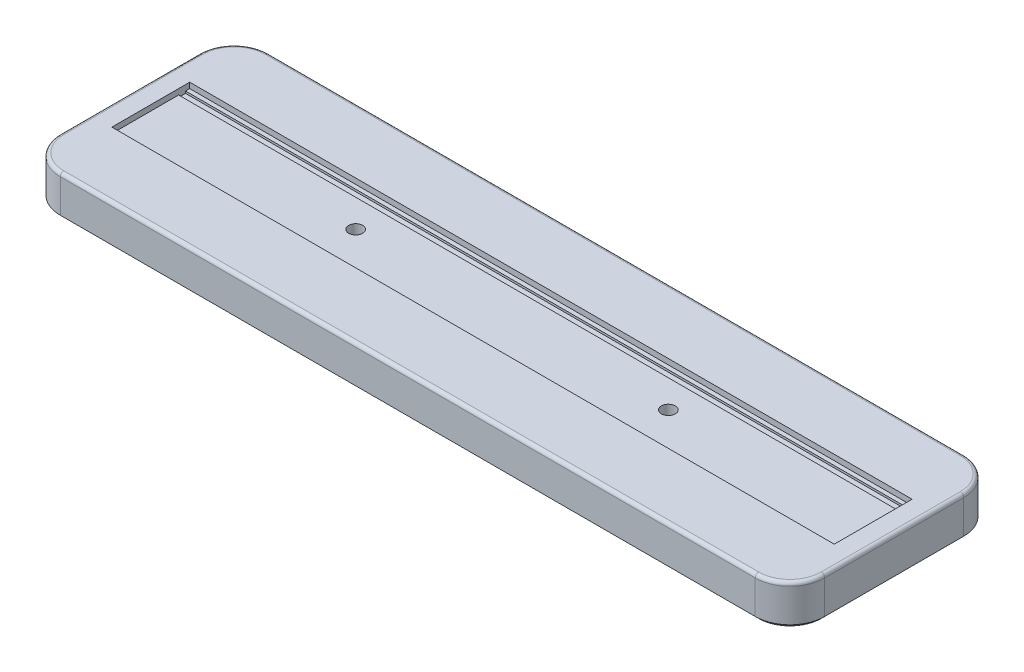
ISO-10303-21;
HEADER;
FILE_DESCRIPTION(('STEP AP214'),'2;1');
FILE_NAME('part.step','',(''),(''),'','','');
FILE_SCHEMA(('AUTOMOTIVE_DESIGN { 1 0 10303 214 1 1 1 1 }'));
ENDSEC;
DATA;
#1=APPLICATION_CONTEXT('core data for automotive mechanical design processes');
#2=APPLICATION_PROTOCOL_DEFINITION('international standard','automotive_design',2000,#1);
#3=PRODUCT_CONTEXT('',#1,'mechanical');
#4=PRODUCT('Part','Part','',(#3));
#5=PRODUCT_RELATED_PRODUCT_CATEGORY('part','',(#4));
#6=PRODUCT_DEFINITION_FORMATION('','',#4);
#7=PRODUCT_DEFINITION_CONTEXT('part definition',#1,'design');
#8=PRODUCT_DEFINITION('design','',#6,#7);
#9=PRODUCT_DEFINITION_SHAPE('','',#8);
#10=(LENGTH_UNIT() NAMED_UNIT(*) SI_UNIT(.MILLI.,.METRE.));
#11=(NAMED_UNIT(*) PLANE_ANGLE_UNIT() SI_UNIT($,.RADIAN.));
#12=(NAMED_UNIT(*) SI_UNIT($,.STERADIAN.) SOLID_ANGLE_UNIT());
#13=UNCERTAINTY_MEASURE_WITH_UNIT(LENGTH_MEASURE(1.E-05),#10,'distance_accuracy_value','');
#14=(GEOMETRIC_REPRESENTATION_CONTEXT(3) GLOBAL_UNCERTAINTY_ASSIGNED_CONTEXT((#13)) GLOBAL_UNIT_ASSIGNED_CONTEXT((#10,
#11,#12)) REPRESENTATION_CONTEXT('',''));
#15=CARTESIAN_POINT('',(0.,0.,0.));
#16=DIRECTION('',(0.,0.,1.));
#17=DIRECTION('',(1.,0.,0.));
#18=AXIS2_PLACEMENT_3D('',#15,#16,#17);
#19=CARTESIAN_POINT('',(0.,10.,0.));
#20=DIRECTION('',(0.,-1.,0.));
#21=DIRECTION('',(0.,0.,-1.));
#22=AXIS2_PLACEMENT_3D('',#19,#20,#21);
#23=PLANE('',#22);
#24=DIRECTION('',(0.,0.,1.));
#25=VECTOR('',#24,1.);
#26=CARTESIAN_POINT('',(-103.95,10.,11.2));
#27=LINE('',#26,#25);
#28=CARTESIAN_POINT('',(-103.95,10.,-11.2));
#29=VERTEX_POINT('',#28);
#30=CARTESIAN_POINT('',(-103.95,10.,-10.));
#31=VERTEX_POINT('',#30);
#32=EDGE_CURVE('E281',#29,#31,#27,.T.);
#33=ORIENTED_EDGE('',*,*,#32,.T.);
#34=DIRECTION('',(-1.,0.,0.));
#35=VECTOR('',#34,1.);
#36=CARTESIAN_POINT('',(-103.95,10.,-10.));
#37=LINE('',#36,#35);
#38=CARTESIAN_POINT('',(103.95,10.,-10.));
#39=VERTEX_POINT('',#38);
#40=EDGE_CURVE('E59',#39,#31,#37,.T.);
#41=ORIENTED_EDGE('',*,*,#40,.F.);
#42=DIRECTION('',(0.,0.,-1.));
#43=VECTOR('',#42,1.);
#44=CARTESIAN_POINT('',(103.95,10.,11.2));
#45=LINE('',#44,#43);
#46=CARTESIAN_POINT('',(103.95,10.,-11.2));
#47=VERTEX_POINT('',#46);
#48=EDGE_CURVE('E274',#39,#47,#45,.T.);
#49=ORIENTED_EDGE('',*,*,#48,.T.);
#50=DIRECTION('',(-1.,0.,0.));
#51=VECTOR('',#50,1.);
#52=CARTESIAN_POINT('',(-103.95,10.,-11.2));
#53=LINE('',#52,#51);
#54=EDGE_CURVE('E278',#47,#29,#53,.T.);
#55=ORIENTED_EDGE('',*,*,#54,.T.);
#56=EDGE_LOOP('',(#33,#41,#49,#55));
#57=FACE_BOUND('',#56,.T.);
#58=ADVANCED_FACE('F41',(#57),#23,.F.);
#59=CARTESIAN_POINT('',(103.95,10.,11.2));
#60=VERTEX_POINT('',#59);
#61=CARTESIAN_POINT('',(103.95,10.,-8.));
#62=VERTEX_POINT('',#61);
#63=EDGE_CURVE('E275',#60,#62,#45,.T.);
#64=ORIENTED_EDGE('',*,*,#63,.T.);
#65=DIRECTION('',(1.,0.,0.));
#66=VECTOR('',#65,1.);
#67=CARTESIAN_POINT('',(-103.95,10.,-8.));
#68=LINE('',#67,#66);
#69=CARTESIAN_POINT('',(-103.95,10.,-8.));
#70=VERTEX_POINT('',#69);
#71=EDGE_CURVE('E232',#70,#62,#68,.T.);
#72=ORIENTED_EDGE('',*,*,#71,.F.);
#73=CARTESIAN_POINT('',(-103.95,10.,11.2));
#74=VERTEX_POINT('',#73);
#75=EDGE_CURVE('E214',#70,#74,#27,.T.);
#76=ORIENTED_EDGE('',*,*,#75,.T.);
#77=DIRECTION('',(1.,0.,0.));
#78=VECTOR('',#77,1.);
#79=CARTESIAN_POINT('',(-103.95,10.,11.2));
#80=LINE('',#79,#78);
#81=EDGE_CURVE('E284',#74,#60,#80,.T.);
#82=ORIENTED_EDGE('',*,*,#81,.T.);
#83=EDGE_LOOP('',(#64,#72,#76,#82));
#84=FACE_BOUND('',#83,.T.);
#85=CARTESIAN_POINT('',(-45.,10.,0.));
#86=DIRECTION('',(0.,1.,0.));
#87=DIRECTION('',(0.,0.,1.));
#88=AXIS2_PLACEMENT_3D('',#85,#86,#87);
#89=CIRCLE('',#88,2.);
#90=CARTESIAN_POINT('',(-45.,10.,2.));
#91=VERTEX_POINT('',#90);
#92=EDGE_CURVE('E271',#91,#91,#89,.T.);
#93=ORIENTED_EDGE('',*,*,#92,.F.);
#94=EDGE_LOOP('',(#93));
#95=FACE_BOUND('',#94,.T.);
#96=CARTESIAN_POINT('',(45.,10.,0.));
#97=DIRECTION('',(0.,1.,0.));
#98=DIRECTION('',(0.,0.,1.));
#99=AXIS2_PLACEMENT_3D('',#96,#97,#98);
#100=CIRCLE('',#99,2.);
#101=CARTESIAN_POINT('',(45.,10.,1.99999999999999));
#102=VERTEX_POINT('',#101);
#103=EDGE_CURVE('E247',#102,#102,#100,.T.);
#104=ORIENTED_EDGE('',*,*,#103,.F.);
#105=EDGE_LOOP('',(#104));
#106=FACE_BOUND('',#105,.T.);
#107=ADVANCED_FACE('F522',(#84,#95,#106),#23,.F.);
#108=CARTESIAN_POINT('',(0.,0.,0.));
#109=DIRECTION('',(0.,-1.,0.));
#110=DIRECTION('',(0.,0.,-1.));
#111=AXIS2_PLACEMENT_3D('',#108,#109,#110);
#112=PLANE('',#111);
#113=DIRECTION('',(0.,0.,1.));
#114=VECTOR('',#113,1.);
#115=CARTESIAN_POINT('',(109.,0.,0.));
#116=LINE('',#115,#114);
#117=CARTESIAN_POINT('',(109.,0.,-20.));
#118=VERTEX_POINT('',#117);
#119=CARTESIAN_POINT('',(109.,0.,20.));
#120=VERTEX_POINT('',#119);
#121=EDGE_CURVE('E383',#118,#120,#116,.T.);
#122=ORIENTED_EDGE('',*,*,#121,.T.);
#123=CARTESIAN_POINT('',(100.,0.,20.));
#124=DIRECTION('',(0.,-1.,0.));
#125=DIRECTION('',(0.,0.,-1.));
#126=AXIS2_PLACEMENT_3D('',#123,#124,#125);
#127=CIRCLE('',#126,8.99999999999999);
#128=CARTESIAN_POINT('',(100.,0.,29.));
#129=VERTEX_POINT('',#128);
#130=EDGE_CURVE('E385',#120,#129,#127,.T.);
#131=ORIENTED_EDGE('',*,*,#130,.T.);
#132=DIRECTION('',(-1.,0.,0.));
#133=VECTOR('',#132,1.);
#134=CARTESIAN_POINT('',(0.,0.,29.));
#135=LINE('',#134,#133);
#136=CARTESIAN_POINT('',(-100.,0.,29.));
#137=VERTEX_POINT('',#136);
#138=EDGE_CURVE('E371',#129,#137,#135,.T.);
#139=ORIENTED_EDGE('',*,*,#138,.T.);
#140=CARTESIAN_POINT('',(-100.,0.,20.));
#141=DIRECTION('',(0.,-1.,0.));
#142=DIRECTION('',(0.,0.,-1.));
#143=AXIS2_PLACEMENT_3D('',#140,#141,#142);
#144=CIRCLE('',#143,8.99999999999999);
#145=CARTESIAN_POINT('',(-109.,0.,20.));
#146=VERTEX_POINT('',#145);
#147=EDGE_CURVE('E373',#137,#146,#144,.T.);
#148=ORIENTED_EDGE('',*,*,#147,.T.);
#149=DIRECTION('',(0.,0.,-1.));
#150=VECTOR('',#149,1.);
#151=CARTESIAN_POINT('',(-109.,0.,0.));
#152=LINE('',#151,#150);
#153=CARTESIAN_POINT('',(-109.,0.,-20.));
#154=VERTEX_POINT('',#153);
#155=EDGE_CURVE('E375',#146,#154,#152,.T.);
#156=ORIENTED_EDGE('',*,*,#155,.T.);
#157=CARTESIAN_POINT('',(-100.,0.,-20.));
#158=DIRECTION('',(0.,-1.,0.));
#159=DIRECTION('',(0.,0.,-1.));
#160=AXIS2_PLACEMENT_3D('',#157,#158,#159);
#161=CIRCLE('',#160,8.99999999999999);
#162=CARTESIAN_POINT('',(-100.,0.,-29.));
#163=VERTEX_POINT('',#162);
#164=EDGE_CURVE('E377',#154,#163,#161,.T.);
#165=ORIENTED_EDGE('',*,*,#164,.T.);
#166=DIRECTION('',(1.,0.,0.));
#167=VECTOR('',#166,1.);
#168=CARTESIAN_POINT('',(0.,0.,-29.));
#169=LINE('',#168,#167);
#170=CARTESIAN_POINT('',(100.,0.,-29.));
#171=VERTEX_POINT('',#170);
#172=EDGE_CURVE('E379',#163,#171,#169,.T.);
#173=ORIENTED_EDGE('',*,*,#172,.T.);
#174=CARTESIAN_POINT('',(100.,0.,-20.));
#175=DIRECTION('',(0.,-1.,0.));
#176=DIRECTION('',(0.,0.,-1.));
#177=AXIS2_PLACEMENT_3D('',#174,#175,#176);
#178=CIRCLE('',#177,8.99999999999999);
#179=EDGE_CURVE('E381',#171,#118,#178,.T.);
#180=ORIENTED_EDGE('',*,*,#179,.T.);
#181=EDGE_LOOP('',(#122,#131,#139,#148,#156,#165,#173,#180));
#182=FACE_BOUND('',#181,.T.);
#183=CARTESIAN_POINT('',(45.,0.,0.));
#184=DIRECTION('',(0.,-1.,0.));
#185=DIRECTION('',(0.,0.,-1.));
#186=AXIS2_PLACEMENT_3D('',#183,#184,#185);
#187=CIRCLE('',#186,3.);
#188=CARTESIAN_POINT('',(45.,0.,-3.00000000000002));
#189=VERTEX_POINT('',#188);
#190=EDGE_CURVE('E368',#189,#189,#187,.F.);
#191=ORIENTED_EDGE('',*,*,#190,.T.);
#192=EDGE_LOOP('',(#191));
#193=FACE_BOUND('',#192,.T.);
#194=CARTESIAN_POINT('',(-45.,0.,0.));
#195=DIRECTION('',(0.,-1.,0.));
#196=DIRECTION('',(0.,0.,-1.));
#197=AXIS2_PLACEMENT_3D('',#194,#195,#196);
#198=CIRCLE('',#197,3.);
#199=CARTESIAN_POINT('',(-45.,0.,-3.));
#200=VERTEX_POINT('',#199);
#201=EDGE_CURVE('E343',#200,#200,#198,.F.);
#202=ORIENTED_EDGE('',*,*,#201,.T.);
#203=EDGE_LOOP('',(#202));
#204=FACE_BOUND('',#203,.T.);
#205=ADVANCED_FACE('F525',(#182,#193,#204),#112,.T.);
#206=CARTESIAN_POINT('',(-45.,10.,0.));
#207=DIRECTION('',(0.,-1.,0.));
#208=DIRECTION('',(0.,0.,-1.));
#209=AXIS2_PLACEMENT_3D('',#206,#207,#208);
#210=CYLINDRICAL_SURFACE('',#209,2.);
#211=CARTESIAN_POINT('',(-45.,0.999999999999992,0.));
#212=DIRECTION('',(0.,-1.,0.));
#213=DIRECTION('',(0.,0.,-1.));
#214=AXIS2_PLACEMENT_3D('',#211,#212,#213);
#215=CIRCLE('',#214,2.);
#216=CARTESIAN_POINT('',(-45.,0.999999999999992,-2.));
#217=VERTEX_POINT('',#216);
#218=EDGE_CURVE('E12',#217,#217,#215,.T.);
#219=ORIENTED_EDGE('',*,*,#218,.T.);
#220=EDGE_LOOP('',(#219));
#221=FACE_BOUND('',#220,.T.);
#222=ORIENTED_EDGE('',*,*,#92,.T.);
#223=EDGE_LOOP('',(#222));
#224=FACE_BOUND('',#223,.T.);
#225=ADVANCED_FACE('F533',(#221,#224),#210,.F.);
#226=CARTESIAN_POINT('',(45.,10.,0.));
#227=DIRECTION('',(0.,-1.,0.));
#228=DIRECTION('',(0.,0.,-1.));
#229=AXIS2_PLACEMENT_3D('',#226,#227,#228);
#230=CYLINDRICAL_SURFACE('',#229,2.);
#231=CARTESIAN_POINT('',(45.,0.999999999999992,0.));
#232=DIRECTION('',(0.,-1.,0.));
#233=DIRECTION('',(0.,0.,-1.));
#234=AXIS2_PLACEMENT_3D('',#231,#232,#233);
#235=CIRCLE('',#234,2.);
#236=CARTESIAN_POINT('',(45.,0.999999999999992,-2.00000000000002));
#237=VERTEX_POINT('',#236);
#238=EDGE_CURVE('E51',#237,#237,#235,.T.);
#239=ORIENTED_EDGE('',*,*,#238,.T.);
#240=EDGE_LOOP('',(#239));
#241=FACE_BOUND('',#240,.T.);
#242=ORIENTED_EDGE('',*,*,#103,.T.);
#243=EDGE_LOOP('',(#242));
#244=FACE_BOUND('',#243,.T.);
#245=ADVANCED_FACE('F531',(#241,#244),#230,.F.);
#246=CARTESIAN_POINT('',(-103.95,241.235085019828,-11.2));
#247=DIRECTION('',(0.,0.,-1.));
#248=DIRECTION('',(-1.,0.,0.));
#249=AXIS2_PLACEMENT_3D('',#246,#247,#248);
#250=PLANE('',#249);
#251=DIRECTION('',(0.,-1.,0.));
#252=VECTOR('',#251,1.);
#253=CARTESIAN_POINT('',(-103.95,241.235085019828,-11.2));
#254=LINE('',#253,#252);
#255=CARTESIAN_POINT('',(-103.95,11.6,-11.2));
#256=VERTEX_POINT('',#255);
#257=EDGE_CURVE('E263',#256,#29,#254,.T.);
#258=ORIENTED_EDGE('',*,*,#257,.T.);
#259=ORIENTED_EDGE('',*,*,#54,.F.);
#260=DIRECTION('',(0.,-1.,0.));
#261=VECTOR('',#260,1.);
#262=CARTESIAN_POINT('',(103.95,241.235085019828,-11.2));
#263=LINE('',#262,#261);
#264=CARTESIAN_POINT('',(103.95,11.6,-11.2));
#265=VERTEX_POINT('',#264);
#266=EDGE_CURVE('E260',#265,#47,#263,.T.);
#267=ORIENTED_EDGE('',*,*,#266,.F.);
#268=DIRECTION('',(-1.,0.,0.));
#269=VECTOR('',#268,1.);
#270=CARTESIAN_POINT('',(-103.95,11.6,-11.2));
#271=LINE('',#270,#269);
#272=EDGE_CURVE('E254',#265,#256,#271,.T.);
#273=ORIENTED_EDGE('',*,*,#272,.T.);
#274=EDGE_LOOP('',(#258,#259,#267,#273));
#275=FACE_BOUND('',#274,.T.);
#276=ADVANCED_FACE('F514',(#275),#250,.F.);
#277=CARTESIAN_POINT('',(-103.95,241.235085019828,11.2));
#278=DIRECTION('',(0.,0.,1.));
#279=DIRECTION('',(1.,0.,0.));
#280=AXIS2_PLACEMENT_3D('',#277,#278,#279);
#281=PLANE('',#280);
#282=DIRECTION('',(0.,-1.,0.));
#283=VECTOR('',#282,1.);
#284=CARTESIAN_POINT('',(103.95,241.235085019828,11.2));
#285=LINE('',#284,#283);
#286=CARTESIAN_POINT('',(103.95,11.6,11.2));
#287=VERTEX_POINT('',#286);
#288=EDGE_CURVE('E257',#287,#60,#285,.T.);
#289=ORIENTED_EDGE('',*,*,#288,.T.);
#290=ORIENTED_EDGE('',*,*,#81,.F.);
#291=DIRECTION('',(0.,-1.,0.));
#292=VECTOR('',#291,1.);
#293=CARTESIAN_POINT('',(-103.95,241.235085019828,11.2));
#294=LINE('',#293,#292);
#295=CARTESIAN_POINT('',(-103.95,11.6,11.2));
#296=VERTEX_POINT('',#295);
#297=EDGE_CURVE('E255',#296,#74,#294,.T.);
#298=ORIENTED_EDGE('',*,*,#297,.F.);
#299=DIRECTION('',(1.,0.,0.));
#300=VECTOR('',#299,1.);
#301=CARTESIAN_POINT('',(-103.95,11.6,11.2));
#302=LINE('',#301,#300);
#303=EDGE_CURVE('E248',#296,#287,#302,.T.);
#304=ORIENTED_EDGE('',*,*,#303,.T.);
#305=EDGE_LOOP('',(#289,#290,#298,#304));
#306=FACE_BOUND('',#305,.T.);
#307=ADVANCED_FACE('F520',(#306),#281,.F.);
#308=CARTESIAN_POINT('',(103.95,241.235085019828,11.2));
#309=DIRECTION('',(1.,0.,0.));
#310=DIRECTION('',(0.,0.,-1.));
#311=AXIS2_PLACEMENT_3D('',#308,#309,#310);
#312=PLANE('',#311);
#313=ORIENTED_EDGE('',*,*,#266,.T.);
#314=ORIENTED_EDGE('',*,*,#48,.F.);
#315=DIRECTION('',(0.,1.,0.));
#316=VECTOR('',#315,1.);
#317=CARTESIAN_POINT('',(103.95,9.4,-10.));
#318=LINE('',#317,#316);
#319=CARTESIAN_POINT('',(103.95,9.4,-10.));
#320=VERTEX_POINT('',#319);
#321=EDGE_CURVE('E241',#320,#39,#318,.T.);
#322=ORIENTED_EDGE('',*,*,#321,.F.);
#323=DIRECTION('',(0.,0.,-1.));
#324=VECTOR('',#323,1.);
#325=CARTESIAN_POINT('',(103.95,9.4,-10.));
#326=LINE('',#325,#324);
#327=CARTESIAN_POINT('',(103.95,9.4,-8.));
#328=VERTEX_POINT('',#327);
#329=EDGE_CURVE('E227',#328,#320,#326,.T.);
#330=ORIENTED_EDGE('',*,*,#329,.F.);
#331=DIRECTION('',(0.,1.,0.));
#332=VECTOR('',#331,1.);
#333=CARTESIAN_POINT('',(103.95,9.4,-8.));
#334=LINE('',#333,#332);
#335=EDGE_CURVE('E218',#328,#62,#334,.T.);
#336=ORIENTED_EDGE('',*,*,#335,.T.);
#337=ORIENTED_EDGE('',*,*,#63,.F.);
#338=ORIENTED_EDGE('',*,*,#288,.F.);
#339=DIRECTION('',(0.,0.,-1.));
#340=VECTOR('',#339,1.);
#341=CARTESIAN_POINT('',(103.95,11.6,11.2));
#342=LINE('',#341,#340);
#343=EDGE_CURVE('E244',#287,#265,#342,.T.);
#344=ORIENTED_EDGE('',*,*,#343,.T.);
#345=EDGE_LOOP('',(#313,#314,#322,#330,#336,#337,#338,#344));
#346=FACE_BOUND('',#345,.T.);
#347=ADVANCED_FACE('F511',(#346),#312,.F.);
#348=CARTESIAN_POINT('',(-103.95,241.235085019828,11.2));
#349=DIRECTION('',(-1.,0.,0.));
#350=DIRECTION('',(0.,0.,1.));
#351=AXIS2_PLACEMENT_3D('',#348,#349,#350);
#352=PLANE('',#351);
#353=ORIENTED_EDGE('',*,*,#297,.T.);
#354=ORIENTED_EDGE('',*,*,#75,.F.);
#355=DIRECTION('',(0.,1.,0.));
#356=VECTOR('',#355,1.);
#357=CARTESIAN_POINT('',(-103.95,9.4,-8.));
#358=LINE('',#357,#356);
#359=CARTESIAN_POINT('',(-103.95,9.4,-8.));
#360=VERTEX_POINT('',#359);
#361=EDGE_CURVE('E207',#360,#70,#358,.T.);
#362=ORIENTED_EDGE('',*,*,#361,.F.);
#363=DIRECTION('',(0.,0.,1.));
#364=VECTOR('',#363,1.);
#365=CARTESIAN_POINT('',(-103.95,9.4,-10.));
#366=LINE('',#365,#364);
#367=CARTESIAN_POINT('',(-103.95,9.4,-10.));
#368=VERTEX_POINT('',#367);
#369=EDGE_CURVE('E212',#368,#360,#366,.T.);
#370=ORIENTED_EDGE('',*,*,#369,.F.);
#371=DIRECTION('',(0.,1.,0.));
#372=VECTOR('',#371,1.);
#373=CARTESIAN_POINT('',(-103.95,9.4,-10.));
#374=LINE('',#373,#372);
#375=EDGE_CURVE('E238',#368,#31,#374,.T.);
#376=ORIENTED_EDGE('',*,*,#375,.T.);
#377=ORIENTED_EDGE('',*,*,#32,.F.);
#378=ORIENTED_EDGE('',*,*,#257,.F.);
#379=DIRECTION('',(0.,0.,1.));
#380=VECTOR('',#379,1.);
#381=CARTESIAN_POINT('',(-103.95,11.6,11.2));
#382=LINE('',#381,#380);
#383=EDGE_CURVE('E251',#256,#296,#382,.T.);
#384=ORIENTED_EDGE('',*,*,#383,.T.);
#385=EDGE_LOOP('',(#353,#354,#362,#370,#376,#377,#378,#384));
#386=FACE_BOUND('',#385,.T.);
#387=ADVANCED_FACE('F210',(#386),#352,.F.);
#388=CARTESIAN_POINT('',(-110.,241.235085019828,30.));
#389=DIRECTION('',(0.,0.,1.));
#390=DIRECTION('',(1.,0.,0.));
#391=AXIS2_PLACEMENT_3D('',#388,#389,#390);
#392=PLANE('',#391);
#393=DIRECTION('',(0.,-1.,0.));
#394=VECTOR('',#393,1.);
#395=CARTESIAN_POINT('',(-100.,241.235085019828,30.));
#396=LINE('',#395,#394);
#397=CARTESIAN_POINT('',(-100.,10.6,30.));
#398=VERTEX_POINT('',#397);
#399=CARTESIAN_POINT('',(-100.,1.,30.));
#400=VERTEX_POINT('',#399);
#401=EDGE_CURVE('E289',#398,#400,#396,.T.);
#402=ORIENTED_EDGE('',*,*,#401,.T.);
#403=DIRECTION('',(1.,0.,0.));
#404=VECTOR('',#403,1.);
#405=CARTESIAN_POINT('',(-110.,1.,30.));
#406=LINE('',#405,#404);
#407=CARTESIAN_POINT('',(100.,1.,30.));
#408=VERTEX_POINT('',#407);
#409=EDGE_CURVE('E402',#400,#408,#406,.T.);
#410=ORIENTED_EDGE('',*,*,#409,.T.);
#411=DIRECTION('',(0.,-1.,0.));
#412=VECTOR('',#411,1.);
#413=CARTESIAN_POINT('',(100.,241.235085019828,30.));
#414=LINE('',#413,#412);
#415=CARTESIAN_POINT('',(100.,10.6,30.));
#416=VERTEX_POINT('',#415);
#417=EDGE_CURVE('E287',#408,#416,#414,.F.);
#418=ORIENTED_EDGE('',*,*,#417,.T.);
#419=DIRECTION('',(1.,0.,0.));
#420=VECTOR('',#419,1.);
#421=CARTESIAN_POINT('',(-100.,10.6,30.));
#422=LINE('',#421,#420);
#423=EDGE_CURVE('E331',#416,#398,#422,.F.);
#424=ORIENTED_EDGE('',*,*,#423,.T.);
#425=EDGE_LOOP('',(#402,#410,#418,#424));
#426=FACE_BOUND('',#425,.T.);
#427=ADVANCED_FACE('F494',(#426),#392,.T.);
#428=CARTESIAN_POINT('',(-110.,241.235085019828,-30.));
#429=DIRECTION('',(-1.,0.,0.));
#430=DIRECTION('',(0.,0.,1.));
#431=AXIS2_PLACEMENT_3D('',#428,#429,#430);
#432=PLANE('',#431);
#433=DIRECTION('',(0.,-1.,0.));
#434=VECTOR('',#433,1.);
#435=CARTESIAN_POINT('',(-110.,241.235085019828,-20.));
#436=LINE('',#435,#434);
#437=CARTESIAN_POINT('',(-110.,10.6,-20.));
#438=VERTEX_POINT('',#437);
#439=CARTESIAN_POINT('',(-110.,1.,-20.));
#440=VERTEX_POINT('',#439);
#441=EDGE_CURVE('E291',#438,#440,#436,.T.);
#442=ORIENTED_EDGE('',*,*,#441,.T.);
#443=DIRECTION('',(0.,0.,1.));
#444=VECTOR('',#443,1.);
#445=CARTESIAN_POINT('',(-110.,1.,-30.));
#446=LINE('',#445,#444);
#447=CARTESIAN_POINT('',(-110.,1.,20.));
#448=VERTEX_POINT('',#447);
#449=EDGE_CURVE('E399',#440,#448,#446,.T.);
#450=ORIENTED_EDGE('',*,*,#449,.T.);
#451=DIRECTION('',(0.,-1.,0.));
#452=VECTOR('',#451,1.);
#453=CARTESIAN_POINT('',(-110.,241.235085019828,20.));
#454=LINE('',#453,#452);
#455=CARTESIAN_POINT('',(-110.,10.6,20.));
#456=VERTEX_POINT('',#455);
#457=EDGE_CURVE('E294',#448,#456,#454,.F.);
#458=ORIENTED_EDGE('',*,*,#457,.T.);
#459=DIRECTION('',(0.,0.,1.));
#460=VECTOR('',#459,1.);
#461=CARTESIAN_POINT('',(-110.,10.6,-20.));
#462=LINE('',#461,#460);
#463=EDGE_CURVE('E336',#456,#438,#462,.F.);
#464=ORIENTED_EDGE('',*,*,#463,.T.);
#465=EDGE_LOOP('',(#442,#450,#458,#464));
#466=FACE_BOUND('',#465,.T.);
#467=ADVANCED_FACE('F443',(#466),#432,.T.);
#468=CARTESIAN_POINT('',(-110.,241.235085019828,-30.));
#469=DIRECTION('',(0.,0.,-1.));
#470=DIRECTION('',(-1.,0.,0.));
#471=AXIS2_PLACEMENT_3D('',#468,#469,#470);
#472=PLANE('',#471);
#473=DIRECTION('',(0.,-1.,0.));
#474=VECTOR('',#473,1.);
#475=CARTESIAN_POINT('',(100.,241.235085019828,-30.));
#476=LINE('',#475,#474);
#477=CARTESIAN_POINT('',(100.,10.6,-30.));
#478=VERTEX_POINT('',#477);
#479=CARTESIAN_POINT('',(100.,1.,-30.));
#480=VERTEX_POINT('',#479);
#481=EDGE_CURVE('E296',#478,#480,#476,.T.);
#482=ORIENTED_EDGE('',*,*,#481,.T.);
#483=DIRECTION('',(-1.,0.,0.));
#484=VECTOR('',#483,1.);
#485=CARTESIAN_POINT('',(-110.,1.,-30.));
#486=LINE('',#485,#484);
#487=CARTESIAN_POINT('',(-100.,1.,-30.));
#488=VERTEX_POINT('',#487);
#489=EDGE_CURVE('E395',#480,#488,#486,.T.);
#490=ORIENTED_EDGE('',*,*,#489,.T.);
#491=DIRECTION('',(0.,-1.,0.));
#492=VECTOR('',#491,1.);
#493=CARTESIAN_POINT('',(-100.,241.235085019828,-30.));
#494=LINE('',#493,#492);
#495=CARTESIAN_POINT('',(-100.,10.6,-30.));
#496=VERTEX_POINT('',#495);
#497=EDGE_CURVE('E299',#488,#496,#494,.F.);
#498=ORIENTED_EDGE('',*,*,#497,.T.);
#499=DIRECTION('',(-1.,0.,0.));
#500=VECTOR('',#499,1.);
#501=CARTESIAN_POINT('',(100.,10.6,-30.));
#502=LINE('',#501,#500);
#503=EDGE_CURVE('E341',#496,#478,#502,.F.);
#504=ORIENTED_EDGE('',*,*,#503,.T.);
#505=EDGE_LOOP('',(#482,#490,#498,#504));
#506=FACE_BOUND('',#505,.T.);
#507=ADVANCED_FACE('F461',(#506),#472,.T.);
#508=CARTESIAN_POINT('',(110.,241.235085019828,-30.));
#509=DIRECTION('',(1.,0.,0.));
#510=DIRECTION('',(0.,0.,-1.));
#511=AXIS2_PLACEMENT_3D('',#508,#509,#510);
#512=PLANE('',#511);
#513=DIRECTION('',(0.,-1.,0.));
#514=VECTOR('',#513,1.);
#515=CARTESIAN_POINT('',(110.,241.235085019828,20.));
#516=LINE('',#515,#514);
#517=CARTESIAN_POINT('',(110.,10.6,20.));
#518=VERTEX_POINT('',#517);
#519=CARTESIAN_POINT('',(110.,1.,20.));
#520=VERTEX_POINT('',#519);
#521=EDGE_CURVE('E303',#518,#520,#516,.T.);
#522=ORIENTED_EDGE('',*,*,#521,.T.);
#523=DIRECTION('',(0.,0.,-1.));
#524=VECTOR('',#523,1.);
#525=CARTESIAN_POINT('',(110.,1.,-30.));
#526=LINE('',#525,#524);
#527=CARTESIAN_POINT('',(110.,1.,-20.));
#528=VERTEX_POINT('',#527);
#529=EDGE_CURVE('E391',#520,#528,#526,.T.);
#530=ORIENTED_EDGE('',*,*,#529,.T.);
#531=DIRECTION('',(0.,-1.,0.));
#532=VECTOR('',#531,1.);
#533=CARTESIAN_POINT('',(110.,241.235085019828,-20.));
#534=LINE('',#533,#532);
#535=CARTESIAN_POINT('',(110.,10.6,-20.));
#536=VERTEX_POINT('',#535);
#537=EDGE_CURVE('E301',#528,#536,#534,.F.);
#538=ORIENTED_EDGE('',*,*,#537,.T.);
#539=DIRECTION('',(0.,0.,-1.));
#540=VECTOR('',#539,1.);
#541=CARTESIAN_POINT('',(110.,10.6,20.));
#542=LINE('',#541,#540);
#543=EDGE_CURVE('E326',#536,#518,#542,.F.);
#544=ORIENTED_EDGE('',*,*,#543,.T.);
#545=EDGE_LOOP('',(#522,#530,#538,#544));
#546=FACE_BOUND('',#545,.T.);
#547=ADVANCED_FACE('F478',(#546),#512,.T.);
#548=CARTESIAN_POINT('',(0.,11.6,0.));
#549=DIRECTION('',(0.,-1.,0.));
#550=DIRECTION('',(0.,0.,-1.));
#551=AXIS2_PLACEMENT_3D('',#548,#549,#550);
#552=PLANE('',#551);
#553=DIRECTION('',(0.,0.,-1.));
#554=VECTOR('',#553,1.);
#555=CARTESIAN_POINT('',(109.,11.6,-20.));
#556=LINE('',#555,#554);
#557=CARTESIAN_POINT('',(109.,11.6,20.));
#558=VERTEX_POINT('',#557);
#559=CARTESIAN_POINT('',(109.,11.6,-20.));
#560=VERTEX_POINT('',#559);
#561=EDGE_CURVE('E318',#558,#560,#556,.T.);
#562=ORIENTED_EDGE('',*,*,#561,.T.);
#563=CARTESIAN_POINT('',(100.,11.6,-20.));
#564=DIRECTION('',(0.,-1.,0.));
#565=DIRECTION('',(0.,0.,-1.));
#566=AXIS2_PLACEMENT_3D('',#563,#564,#565);
#567=CIRCLE('',#566,9.);
#568=CARTESIAN_POINT('',(100.,11.6,-29.));
#569=VERTEX_POINT('',#568);
#570=EDGE_CURVE('E320',#560,#569,#567,.F.);
#571=ORIENTED_EDGE('',*,*,#570,.T.);
#572=DIRECTION('',(-1.,0.,0.));
#573=VECTOR('',#572,1.);
#574=CARTESIAN_POINT('',(-100.,11.6,-29.));
#575=LINE('',#574,#573);
#576=CARTESIAN_POINT('',(-100.,11.6,-29.));
#577=VERTEX_POINT('',#576);
#578=EDGE_CURVE('E306',#569,#577,#575,.T.);
#579=ORIENTED_EDGE('',*,*,#578,.T.);
#580=CARTESIAN_POINT('',(-100.,11.6,-20.));
#581=DIRECTION('',(0.,-1.,0.));
#582=DIRECTION('',(0.,0.,-1.));
#583=AXIS2_PLACEMENT_3D('',#580,#581,#582);
#584=CIRCLE('',#583,9.);
#585=CARTESIAN_POINT('',(-109.,11.6,-20.));
#586=VERTEX_POINT('',#585);
#587=EDGE_CURVE('E308',#577,#586,#584,.F.);
#588=ORIENTED_EDGE('',*,*,#587,.T.);
#589=DIRECTION('',(0.,0.,1.));
#590=VECTOR('',#589,1.);
#591=CARTESIAN_POINT('',(-109.,11.6,20.));
#592=LINE('',#591,#590);
#593=CARTESIAN_POINT('',(-109.,11.6,20.));
#594=VERTEX_POINT('',#593);
#595=EDGE_CURVE('E310',#586,#594,#592,.T.);
#596=ORIENTED_EDGE('',*,*,#595,.T.);
#597=CARTESIAN_POINT('',(-100.,11.6,20.));
#598=DIRECTION('',(0.,-1.,0.));
#599=DIRECTION('',(0.,0.,-1.));
#600=AXIS2_PLACEMENT_3D('',#597,#598,#599);
#601=CIRCLE('',#600,9.);
#602=CARTESIAN_POINT('',(-100.,11.6,29.));
#603=VERTEX_POINT('',#602);
#604=EDGE_CURVE('E312',#594,#603,#601,.F.);
#605=ORIENTED_EDGE('',*,*,#604,.T.);
#606=DIRECTION('',(1.,0.,0.));
#607=VECTOR('',#606,1.);
#608=CARTESIAN_POINT('',(100.,11.6,29.));
#609=LINE('',#608,#607);
#610=CARTESIAN_POINT('',(100.,11.6,29.));
#611=VERTEX_POINT('',#610);
#612=EDGE_CURVE('E314',#603,#611,#609,.T.);
#613=ORIENTED_EDGE('',*,*,#612,.T.);
#614=CARTESIAN_POINT('',(100.,11.6,20.));
#615=DIRECTION('',(0.,-1.,0.));
#616=DIRECTION('',(0.,0.,-1.));
#617=AXIS2_PLACEMENT_3D('',#614,#615,#616);
#618=CIRCLE('',#617,9.);
#619=EDGE_CURVE('E316',#611,#558,#618,.F.);
#620=ORIENTED_EDGE('',*,*,#619,.T.);
#621=EDGE_LOOP('',(#562,#571,#579,#588,#596,#605,#613,#620));
#622=FACE_BOUND('',#621,.T.);
#623=ORIENTED_EDGE('',*,*,#272,.F.);
#624=ORIENTED_EDGE('',*,*,#343,.F.);
#625=ORIENTED_EDGE('',*,*,#303,.F.);
#626=ORIENTED_EDGE('',*,*,#383,.F.);
#627=EDGE_LOOP('',(#623,#624,#625,#626));
#628=FACE_BOUND('',#627,.T.);
#629=ADVANCED_FACE('F502',(#622,#628),#552,.F.);
#630=CARTESIAN_POINT('',(-100.,241.235085019828,20.));
#631=DIRECTION('',(0.,-1.,0.));
#632=DIRECTION('',(0.,0.,-1.));
#633=AXIS2_PLACEMENT_3D('',#630,#631,#632);
#634=CYLINDRICAL_SURFACE('',#633,10.);
#635=ORIENTED_EDGE('',*,*,#457,.F.);
#636=CARTESIAN_POINT('',(-100.,1.,20.));
#637=DIRECTION('',(0.,-1.,0.));
#638=DIRECTION('',(0.,0.,-1.));
#639=AXIS2_PLACEMENT_3D('',#636,#637,#638);
#640=CIRCLE('',#639,10.);
#641=EDGE_CURVE('E67',#448,#400,#640,.F.);
#642=ORIENTED_EDGE('',*,*,#641,.T.);
#643=ORIENTED_EDGE('',*,*,#401,.F.);
#644=CARTESIAN_POINT('',(-100.,10.6,20.));
#645=DIRECTION('',(0.,-1.,0.));
#646=DIRECTION('',(0.,0.,-1.));
#647=AXIS2_PLACEMENT_3D('',#644,#645,#646);
#648=CIRCLE('',#647,10.);
#649=EDGE_CURVE('E333',#398,#456,#648,.T.);
#650=ORIENTED_EDGE('',*,*,#649,.T.);
#651=EDGE_LOOP('',(#635,#642,#643,#650));
#652=FACE_BOUND('',#651,.T.);
#653=ADVANCED_FACE('F497',(#652),#634,.T.);
#654=CARTESIAN_POINT('',(-100.,241.235085019828,-20.));
#655=DIRECTION('',(0.,-1.,0.));
#656=DIRECTION('',(0.,0.,-1.));
#657=AXIS2_PLACEMENT_3D('',#654,#655,#656);
#658=CYLINDRICAL_SURFACE('',#657,10.);
#659=ORIENTED_EDGE('',*,*,#497,.F.);
#660=CARTESIAN_POINT('',(-100.,1.,-20.));
#661=DIRECTION('',(0.,-1.,0.));
#662=DIRECTION('',(0.,0.,-1.));
#663=AXIS2_PLACEMENT_3D('',#660,#661,#662);
#664=CIRCLE('',#663,10.);
#665=EDGE_CURVE('E397',#488,#440,#664,.F.);
#666=ORIENTED_EDGE('',*,*,#665,.T.);
#667=ORIENTED_EDGE('',*,*,#441,.F.);
#668=CARTESIAN_POINT('',(-100.,10.6,-20.));
#669=DIRECTION('',(0.,-1.,0.));
#670=DIRECTION('',(0.,0.,-1.));
#671=AXIS2_PLACEMENT_3D('',#668,#669,#670);
#672=CIRCLE('',#671,10.);
#673=EDGE_CURVE('E338',#438,#496,#672,.T.);
#674=ORIENTED_EDGE('',*,*,#673,.T.);
#675=EDGE_LOOP('',(#659,#666,#667,#674));
#676=FACE_BOUND('',#675,.T.);
#677=ADVANCED_FACE('F440',(#676),#658,.T.);
#678=CARTESIAN_POINT('',(100.,241.235085019828,20.));
#679=DIRECTION('',(0.,-1.,0.));
#680=DIRECTION('',(0.,0.,-1.));
#681=AXIS2_PLACEMENT_3D('',#678,#679,#680);
#682=CYLINDRICAL_SURFACE('',#681,10.);
#683=ORIENTED_EDGE('',*,*,#417,.F.);
#684=CARTESIAN_POINT('',(100.,1.,20.));
#685=DIRECTION('',(0.,-1.,0.));
#686=DIRECTION('',(0.,0.,-1.));
#687=AXIS2_PLACEMENT_3D('',#684,#685,#686);
#688=CIRCLE('',#687,10.);
#689=EDGE_CURVE('E388',#408,#520,#688,.F.);
#690=ORIENTED_EDGE('',*,*,#689,.T.);
#691=ORIENTED_EDGE('',*,*,#521,.F.);
#692=CARTESIAN_POINT('',(100.,10.6,20.));
#693=DIRECTION('',(0.,-1.,0.));
#694=DIRECTION('',(0.,0.,-1.));
#695=AXIS2_PLACEMENT_3D('',#692,#693,#694);
#696=CIRCLE('',#695,10.);
#697=EDGE_CURVE('E328',#518,#416,#696,.T.);
#698=ORIENTED_EDGE('',*,*,#697,.T.);
#699=EDGE_LOOP('',(#683,#690,#691,#698));
#700=FACE_BOUND('',#699,.T.);
#701=ADVANCED_FACE('F482',(#700),#682,.T.);
#702=CARTESIAN_POINT('',(100.,241.235085019828,-20.));
#703=DIRECTION('',(0.,-1.,0.));
#704=DIRECTION('',(0.,0.,-1.));
#705=AXIS2_PLACEMENT_3D('',#702,#703,#704);
#706=CYLINDRICAL_SURFACE('',#705,10.);
#707=ORIENTED_EDGE('',*,*,#537,.F.);
#708=CARTESIAN_POINT('',(100.,1.,-20.));
#709=DIRECTION('',(0.,-1.,0.));
#710=DIRECTION('',(0.,0.,-1.));
#711=AXIS2_PLACEMENT_3D('',#708,#709,#710);
#712=CIRCLE('',#711,10.);
#713=EDGE_CURVE('E393',#528,#480,#712,.F.);
#714=ORIENTED_EDGE('',*,*,#713,.T.);
#715=ORIENTED_EDGE('',*,*,#481,.F.);
#716=CARTESIAN_POINT('',(100.,10.6,-20.));
#717=DIRECTION('',(0.,-1.,0.));
#718=DIRECTION('',(0.,0.,-1.));
#719=AXIS2_PLACEMENT_3D('',#716,#717,#718);
#720=CIRCLE('',#719,10.);
#721=EDGE_CURVE('E323',#478,#536,#720,.T.);
#722=ORIENTED_EDGE('',*,*,#721,.T.);
#723=EDGE_LOOP('',(#707,#714,#715,#722));
#724=FACE_BOUND('',#723,.T.);
#725=ADVANCED_FACE('F465',(#724),#706,.T.);
#726=CARTESIAN_POINT('',(-100.,10.6,20.));
#727=DIRECTION('',(0.,-1.,0.));
#728=DIRECTION('',(0.,0.,-1.));
#729=AXIS2_PLACEMENT_3D('',#726,#727,#728);
#730=TOROIDAL_SURFACE('',#729,9.,1.);
#731=CARTESIAN_POINT('',(-109.,10.6,20.));
#732=DIRECTION('',(0.,0.,-1.));
#733=DIRECTION('',(-1.,0.,0.));
#734=AXIS2_PLACEMENT_3D('',#731,#732,#733);
#735=CIRCLE('',#734,1.);
#736=EDGE_CURVE('E361',#456,#594,#735,.T.);
#737=ORIENTED_EDGE('',*,*,#736,.F.);
#738=ORIENTED_EDGE('',*,*,#649,.F.);
#739=CARTESIAN_POINT('',(-100.,10.6,29.));
#740=DIRECTION('',(1.,0.,0.));
#741=DIRECTION('',(0.,0.,-1.));
#742=AXIS2_PLACEMENT_3D('',#739,#740,#741);
#743=CIRCLE('',#742,1.);
#744=EDGE_CURVE('E266',#603,#398,#743,.T.);
#745=ORIENTED_EDGE('',*,*,#744,.F.);
#746=ORIENTED_EDGE('',*,*,#604,.F.);
#747=EDGE_LOOP('',(#737,#738,#745,#746));
#748=FACE_BOUND('',#747,.T.);
#749=ADVANCED_FACE('F499',(#748),#730,.T.);
#750=CARTESIAN_POINT('',(0.,10.6,29.));
#751=DIRECTION('',(-1.,0.,0.));
#752=DIRECTION('',(0.,0.,1.));
#753=AXIS2_PLACEMENT_3D('',#750,#751,#752);
#754=CYLINDRICAL_SURFACE('',#753,1.);
#755=ORIENTED_EDGE('',*,*,#744,.T.);
#756=ORIENTED_EDGE('',*,*,#423,.F.);
#757=CARTESIAN_POINT('',(100.,10.6,29.));
#758=DIRECTION('',(1.,0.,0.));
#759=DIRECTION('',(0.,0.,-1.));
#760=AXIS2_PLACEMENT_3D('',#757,#758,#759);
#761=CIRCLE('',#760,1.);
#762=EDGE_CURVE('E358',#611,#416,#761,.T.);
#763=ORIENTED_EDGE('',*,*,#762,.F.);
#764=ORIENTED_EDGE('',*,*,#612,.F.);
#765=EDGE_LOOP('',(#755,#756,#763,#764));
#766=FACE_BOUND('',#765,.T.);
#767=ADVANCED_FACE('F491',(#766),#754,.T.);
#768=CARTESIAN_POINT('',(-109.,10.6,0.));
#769=DIRECTION('',(0.,0.,-1.));
#770=DIRECTION('',(-1.,0.,0.));
#771=AXIS2_PLACEMENT_3D('',#768,#769,#770);
#772=CYLINDRICAL_SURFACE('',#771,1.);
#773=ORIENTED_EDGE('',*,*,#736,.T.);
#774=ORIENTED_EDGE('',*,*,#595,.F.);
#775=CARTESIAN_POINT('',(-109.,10.6,-20.));
#776=DIRECTION('',(0.,0.,-1.));
#777=DIRECTION('',(-1.,0.,0.));
#778=AXIS2_PLACEMENT_3D('',#775,#776,#777);
#779=CIRCLE('',#778,1.);
#780=EDGE_CURVE('E355',#438,#586,#779,.T.);
#781=ORIENTED_EDGE('',*,*,#780,.F.);
#782=ORIENTED_EDGE('',*,*,#463,.F.);
#783=EDGE_LOOP('',(#773,#774,#781,#782));
#784=FACE_BOUND('',#783,.T.);
#785=ADVANCED_FACE('F446',(#784),#772,.T.);
#786=CARTESIAN_POINT('',(100.,10.6,20.));
#787=DIRECTION('',(0.,-1.,0.));
#788=DIRECTION('',(0.,0.,-1.));
#789=AXIS2_PLACEMENT_3D('',#786,#787,#788);
#790=TOROIDAL_SURFACE('',#789,9.,1.);
#791=ORIENTED_EDGE('',*,*,#762,.T.);
#792=ORIENTED_EDGE('',*,*,#697,.F.);
#793=CARTESIAN_POINT('',(109.,10.6,20.));
#794=DIRECTION('',(0.,0.,-1.));
#795=DIRECTION('',(-1.,0.,0.));
#796=AXIS2_PLACEMENT_3D('',#793,#794,#795);
#797=CIRCLE('',#796,1.);
#798=EDGE_CURVE('E352',#558,#518,#797,.T.);
#799=ORIENTED_EDGE('',*,*,#798,.F.);
#800=ORIENTED_EDGE('',*,*,#619,.F.);
#801=EDGE_LOOP('',(#791,#792,#799,#800));
#802=FACE_BOUND('',#801,.T.);
#803=ADVANCED_FACE('F486',(#802),#790,.T.);
#804=CARTESIAN_POINT('',(-100.,10.6,-20.));
#805=DIRECTION('',(0.,-1.,0.));
#806=DIRECTION('',(0.,0.,-1.));
#807=AXIS2_PLACEMENT_3D('',#804,#805,#806);
#808=TOROIDAL_SURFACE('',#807,9.,1.);
#809=ORIENTED_EDGE('',*,*,#780,.T.);
#810=ORIENTED_EDGE('',*,*,#587,.F.);
#811=CARTESIAN_POINT('',(-100.,10.6,-29.));
#812=DIRECTION('',(1.,0.,0.));
#813=DIRECTION('',(0.,0.,-1.));
#814=AXIS2_PLACEMENT_3D('',#811,#812,#813);
#815=CIRCLE('',#814,1.);
#816=EDGE_CURVE('E349',#496,#577,#815,.T.);
#817=ORIENTED_EDGE('',*,*,#816,.F.);
#818=ORIENTED_EDGE('',*,*,#673,.F.);
#819=EDGE_LOOP('',(#809,#810,#817,#818));
#820=FACE_BOUND('',#819,.T.);
#821=ADVANCED_FACE('F453',(#820),#808,.T.);
#822=CARTESIAN_POINT('',(109.,10.6,0.));
#823=DIRECTION('',(0.,0.,1.));
#824=DIRECTION('',(1.,0.,0.));
#825=AXIS2_PLACEMENT_3D('',#822,#823,#824);
#826=CYLINDRICAL_SURFACE('',#825,1.);
#827=ORIENTED_EDGE('',*,*,#798,.T.);
#828=ORIENTED_EDGE('',*,*,#543,.F.);
#829=CARTESIAN_POINT('',(109.,10.6,-20.));
#830=DIRECTION('',(0.,0.,-1.));
#831=DIRECTION('',(-1.,0.,0.));
#832=AXIS2_PLACEMENT_3D('',#829,#830,#831);
#833=CIRCLE('',#832,1.);
#834=EDGE_CURVE('E346',#560,#536,#833,.T.);
#835=ORIENTED_EDGE('',*,*,#834,.F.);
#836=ORIENTED_EDGE('',*,*,#561,.F.);
#837=EDGE_LOOP('',(#827,#828,#835,#836));
#838=FACE_BOUND('',#837,.T.);
#839=ADVANCED_FACE('F474',(#838),#826,.T.);
#840=CARTESIAN_POINT('',(0.,10.6,-29.));
#841=DIRECTION('',(1.,0.,0.));
#842=DIRECTION('',(0.,0.,-1.));
#843=AXIS2_PLACEMENT_3D('',#840,#841,#842);
#844=CYLINDRICAL_SURFACE('',#843,1.);
#845=ORIENTED_EDGE('',*,*,#816,.T.);
#846=ORIENTED_EDGE('',*,*,#578,.F.);
#847=CARTESIAN_POINT('',(100.,10.6,-29.));
#848=DIRECTION('',(1.,0.,0.));
#849=DIRECTION('',(0.,0.,-1.));
#850=AXIS2_PLACEMENT_3D('',#847,#848,#849);
#851=CIRCLE('',#850,1.);
#852=EDGE_CURVE('E344',#478,#569,#851,.T.);
#853=ORIENTED_EDGE('',*,*,#852,.F.);
#854=ORIENTED_EDGE('',*,*,#503,.F.);
#855=EDGE_LOOP('',(#845,#846,#853,#854));
#856=FACE_BOUND('',#855,.T.);
#857=ADVANCED_FACE('F458',(#856),#844,.T.);
#858=CARTESIAN_POINT('',(100.,10.6,-20.));
#859=DIRECTION('',(0.,-1.,0.));
#860=DIRECTION('',(0.,0.,-1.));
#861=AXIS2_PLACEMENT_3D('',#858,#859,#860);
#862=TOROIDAL_SURFACE('',#861,9.,1.);
#863=ORIENTED_EDGE('',*,*,#834,.T.);
#864=ORIENTED_EDGE('',*,*,#721,.F.);
#865=ORIENTED_EDGE('',*,*,#852,.T.);
#866=ORIENTED_EDGE('',*,*,#570,.F.);
#867=EDGE_LOOP('',(#863,#864,#865,#866));
#868=FACE_BOUND('',#867,.T.);
#869=ADVANCED_FACE('F468',(#868),#862,.T.);
#870=CARTESIAN_POINT('',(-100.,0.,-20.));
#871=DIRECTION('',(0.,1.,0.));
#872=DIRECTION('',(0.,0.,1.));
#873=AXIS2_PLACEMENT_3D('',#870,#871,#872);
#874=CONICAL_SURFACE('',#873,8.99999999999999,0.785398163397451);
#875=DIRECTION('',(0.707106781186547,-0.707106781186547,0.));
#876=VECTOR('',#875,1.);
#877=CARTESIAN_POINT('',(-110.,1.,-20.));
#878=LINE('',#877,#876);
#879=EDGE_CURVE('E420',#440,#154,#878,.T.);
#880=ORIENTED_EDGE('',*,*,#879,.F.);
#881=ORIENTED_EDGE('',*,*,#665,.F.);
#882=DIRECTION('',(0.,0.707106781186546,-0.707106781186549));
#883=VECTOR('',#882,1.);
#884=CARTESIAN_POINT('',(-100.,0.,-29.));
#885=LINE('',#884,#883);
#886=EDGE_CURVE('E46',#163,#488,#885,.T.);
#887=ORIENTED_EDGE('',*,*,#886,.F.);
#888=ORIENTED_EDGE('',*,*,#164,.F.);
#889=EDGE_LOOP('',(#880,#881,#887,#888));
#890=FACE_BOUND('',#889,.T.);
#891=ADVANCED_FACE('F436',(#890),#874,.T.);
#892=CARTESIAN_POINT('',(0.,0.,-29.));
#893=DIRECTION('',(0.,0.707106781186547,0.707106781186547));
#894=DIRECTION('',(1.,0.,0.));
#895=AXIS2_PLACEMENT_3D('',#892,#893,#894);
#896=PLANE('',#895);
#897=ORIENTED_EDGE('',*,*,#886,.T.);
#898=ORIENTED_EDGE('',*,*,#489,.F.);
#899=DIRECTION('',(0.,0.707106781186547,-0.707106781186547));
#900=VECTOR('',#899,1.);
#901=CARTESIAN_POINT('',(100.,0.,-29.));
#902=LINE('',#901,#900);
#903=EDGE_CURVE('E418',#171,#480,#902,.T.);
#904=ORIENTED_EDGE('',*,*,#903,.F.);
#905=ORIENTED_EDGE('',*,*,#172,.F.);
#906=EDGE_LOOP('',(#897,#898,#904,#905));
#907=FACE_BOUND('',#906,.T.);
#908=ADVANCED_FACE('F431',(#907),#896,.F.);
#909=CARTESIAN_POINT('',(-109.,0.,0.));
#910=DIRECTION('',(0.707106781186547,0.707106781186547,0.));
#911=DIRECTION('',(0.,0.,-1.));
#912=AXIS2_PLACEMENT_3D('',#909,#910,#911);
#913=PLANE('',#912);
#914=ORIENTED_EDGE('',*,*,#879,.T.);
#915=ORIENTED_EDGE('',*,*,#155,.F.);
#916=DIRECTION('',(0.707106781186547,-0.707106781186547,0.));
#917=VECTOR('',#916,1.);
#918=CARTESIAN_POINT('',(-110.,1.,20.));
#919=LINE('',#918,#917);
#920=EDGE_CURVE('E415',#448,#146,#919,.T.);
#921=ORIENTED_EDGE('',*,*,#920,.F.);
#922=ORIENTED_EDGE('',*,*,#449,.F.);
#923=EDGE_LOOP('',(#914,#915,#921,#922));
#924=FACE_BOUND('',#923,.T.);
#925=ADVANCED_FACE('F613',(#924),#913,.F.);
#926=CARTESIAN_POINT('',(100.,0.,-20.));
#927=DIRECTION('',(0.,1.,0.));
#928=DIRECTION('',(0.,0.,1.));
#929=AXIS2_PLACEMENT_3D('',#926,#927,#928);
#930=CONICAL_SURFACE('',#929,9.,0.785398163397449);
#931=ORIENTED_EDGE('',*,*,#903,.T.);
#932=ORIENTED_EDGE('',*,*,#713,.F.);
#933=DIRECTION('',(0.707106781186547,0.707106781186548,0.));
#934=VECTOR('',#933,1.);
#935=CARTESIAN_POINT('',(109.,0.,-20.));
#936=LINE('',#935,#934);
#937=EDGE_CURVE('E412',#118,#528,#936,.T.);
#938=ORIENTED_EDGE('',*,*,#937,.F.);
#939=ORIENTED_EDGE('',*,*,#179,.F.);
#940=EDGE_LOOP('',(#931,#932,#938,#939));
#941=FACE_BOUND('',#940,.T.);
#942=ADVANCED_FACE('F606',(#941),#930,.T.);
#943=CARTESIAN_POINT('',(-100.,0.,20.));
#944=DIRECTION('',(0.,1.,0.));
#945=DIRECTION('',(0.,0.,1.));
#946=AXIS2_PLACEMENT_3D('',#943,#944,#945);
#947=CONICAL_SURFACE('',#946,9.,0.785398163397449);
#948=ORIENTED_EDGE('',*,*,#920,.T.);
#949=ORIENTED_EDGE('',*,*,#147,.F.);
#950=DIRECTION('',(0.,-0.707106781186545,-0.70710678118655));
#951=VECTOR('',#950,1.);
#952=CARTESIAN_POINT('',(-100.,1.,30.));
#953=LINE('',#952,#951);
#954=EDGE_CURVE('E409',#400,#137,#953,.T.);
#955=ORIENTED_EDGE('',*,*,#954,.F.);
#956=ORIENTED_EDGE('',*,*,#641,.F.);
#957=EDGE_LOOP('',(#948,#949,#955,#956));
#958=FACE_BOUND('',#957,.T.);
#959=ADVANCED_FACE('F599',(#958),#947,.T.);
#960=CARTESIAN_POINT('',(109.,0.,0.));
#961=DIRECTION('',(-0.707106781186547,0.707106781186547,0.));
#962=DIRECTION('',(0.,0.,1.));
#963=AXIS2_PLACEMENT_3D('',#960,#961,#962);
#964=PLANE('',#963);
#965=ORIENTED_EDGE('',*,*,#937,.T.);
#966=ORIENTED_EDGE('',*,*,#529,.F.);
#967=DIRECTION('',(0.707106781186547,0.707106781186547,0.));
#968=VECTOR('',#967,1.);
#969=CARTESIAN_POINT('',(109.,0.,20.));
#970=LINE('',#969,#968);
#971=EDGE_CURVE('E407',#120,#520,#970,.T.);
#972=ORIENTED_EDGE('',*,*,#971,.F.);
#973=ORIENTED_EDGE('',*,*,#121,.F.);
#974=EDGE_LOOP('',(#965,#966,#972,#973));
#975=FACE_BOUND('',#974,.T.);
#976=ADVANCED_FACE('F592',(#975),#964,.F.);
#977=CARTESIAN_POINT('',(0.,0.,29.));
#978=DIRECTION('',(0.,0.707106781186547,-0.707106781186547));
#979=DIRECTION('',(-1.,0.,0.));
#980=AXIS2_PLACEMENT_3D('',#977,#978,#979);
#981=PLANE('',#980);
#982=ORIENTED_EDGE('',*,*,#954,.T.);
#983=ORIENTED_EDGE('',*,*,#138,.F.);
#984=DIRECTION('',(0.,-0.707106781186547,-0.707106781186547));
#985=VECTOR('',#984,1.);
#986=CARTESIAN_POINT('',(100.,1.,30.));
#987=LINE('',#986,#985);
#988=EDGE_CURVE('E240',#408,#129,#987,.T.);
#989=ORIENTED_EDGE('',*,*,#988,.F.);
#990=ORIENTED_EDGE('',*,*,#409,.F.);
#991=EDGE_LOOP('',(#982,#983,#989,#990));
#992=FACE_BOUND('',#991,.T.);
#993=ADVANCED_FACE('F585',(#992),#981,.F.);
#994=CARTESIAN_POINT('',(100.,0.,20.));
#995=DIRECTION('',(0.,1.,0.));
#996=DIRECTION('',(0.,0.,1.));
#997=AXIS2_PLACEMENT_3D('',#994,#995,#996);
#998=CONICAL_SURFACE('',#997,8.99999999999999,0.785398163397451);
#999=ORIENTED_EDGE('',*,*,#971,.T.);
#1000=ORIENTED_EDGE('',*,*,#689,.F.);
#1001=ORIENTED_EDGE('',*,*,#988,.T.);
#1002=ORIENTED_EDGE('',*,*,#130,.F.);
#1003=EDGE_LOOP('',(#999,#1000,#1001,#1002));
#1004=FACE_BOUND('',#1003,.T.);
#1005=ADVANCED_FACE('F577',(#1004),#998,.T.);
#1006=CARTESIAN_POINT('',(45.,0.,0.));
#1007=DIRECTION('',(0.,-1.,0.));
#1008=DIRECTION('',(0.,0.,-1.));
#1009=AXIS2_PLACEMENT_3D('',#1006,#1007,#1008);
#1010=CONICAL_SURFACE('',#1009,3.,0.785398163397452);
#1011=ORIENTED_EDGE('',*,*,#238,.F.);
#1012=EDGE_LOOP('',(#1011));
#1013=FACE_BOUND('',#1012,.T.);
#1014=ORIENTED_EDGE('',*,*,#190,.F.);
#1015=EDGE_LOOP('',(#1014));
#1016=FACE_BOUND('',#1015,.T.);
#1017=ADVANCED_FACE('F584',(#1013,#1016),#1010,.F.);
#1018=CARTESIAN_POINT('',(-45.,0.,0.));
#1019=DIRECTION('',(0.,-1.,0.));
#1020=DIRECTION('',(0.,0.,-1.));
#1021=AXIS2_PLACEMENT_3D('',#1018,#1019,#1020);
#1022=CONICAL_SURFACE('',#1021,3.,0.785398163397452);
#1023=ORIENTED_EDGE('',*,*,#218,.F.);
#1024=EDGE_LOOP('',(#1023));
#1025=FACE_BOUND('',#1024,.T.);
#1026=ORIENTED_EDGE('',*,*,#201,.F.);
#1027=EDGE_LOOP('',(#1026));
#1028=FACE_BOUND('',#1027,.T.);
#1029=ADVANCED_FACE('F44',(#1025,#1028),#1022,.F.);
#1030=CARTESIAN_POINT('',(-103.95,9.4,-10.));
#1031=DIRECTION('',(0.,0.,-1.));
#1032=DIRECTION('',(-1.,0.,0.));
#1033=AXIS2_PLACEMENT_3D('',#1030,#1031,#1032);
#1034=PLANE('',#1033);
#1035=ORIENTED_EDGE('',*,*,#40,.T.);
#1036=ORIENTED_EDGE('',*,*,#375,.F.);
#1037=DIRECTION('',(-1.,0.,0.));
#1038=VECTOR('',#1037,1.);
#1039=CARTESIAN_POINT('',(-103.95,9.4,-10.));
#1040=LINE('',#1039,#1038);
#1041=EDGE_CURVE('E219',#320,#368,#1040,.T.);
#1042=ORIENTED_EDGE('',*,*,#1041,.F.);
#1043=ORIENTED_EDGE('',*,*,#321,.T.);
#1044=EDGE_LOOP('',(#1035,#1036,#1042,#1043));
#1045=FACE_BOUND('',#1044,.T.);
#1046=ADVANCED_FACE('F516',(#1045),#1034,.F.);
#1047=CARTESIAN_POINT('',(-103.95,9.4,-8.));
#1048=DIRECTION('',(0.,0.,1.));
#1049=DIRECTION('',(1.,0.,0.));
#1050=AXIS2_PLACEMENT_3D('',#1047,#1048,#1049);
#1051=PLANE('',#1050);
#1052=ORIENTED_EDGE('',*,*,#71,.T.);
#1053=ORIENTED_EDGE('',*,*,#335,.F.);
#1054=DIRECTION('',(1.,0.,0.));
#1055=VECTOR('',#1054,1.);
#1056=CARTESIAN_POINT('',(-103.95,9.4,-8.));
#1057=LINE('',#1056,#1055);
#1058=EDGE_CURVE('E222',#360,#328,#1057,.T.);
#1059=ORIENTED_EDGE('',*,*,#1058,.F.);
#1060=ORIENTED_EDGE('',*,*,#361,.T.);
#1061=EDGE_LOOP('',(#1052,#1053,#1059,#1060));
#1062=FACE_BOUND('',#1061,.T.);
#1063=ADVANCED_FACE('F223',(#1062),#1051,.F.);
#1064=CARTESIAN_POINT('',(0.,9.4,0.));
#1065=DIRECTION('',(0.,1.,0.));
#1066=DIRECTION('',(0.,0.,1.));
#1067=AXIS2_PLACEMENT_3D('',#1064,#1065,#1066);
#1068=PLANE('',#1067);
#1069=ORIENTED_EDGE('',*,*,#369,.T.);
#1070=ORIENTED_EDGE('',*,*,#1058,.T.);
#1071=ORIENTED_EDGE('',*,*,#329,.T.);
#1072=ORIENTED_EDGE('',*,*,#1041,.T.);
#1073=EDGE_LOOP('',(#1069,#1070,#1071,#1072));
#1074=FACE_BOUND('',#1073,.T.);
#1075=ADVANCED_FACE('F229',(#1074),#1068,.T.);
#1076=CLOSED_SHELL('',(#58,#107,#205,#225,#245,#276,#307,#347,#387,#427,#467,#507,#547,#629,
#653,#677,#701,#725,#749,#767,#785,#803,#821,#839,#857,#869,#891,#908,#925,#942,#959,#976,#993,
#1005,#1017,#1029,#1046,#1063,#1075));
#1077=MANIFOLD_SOLID_BREP('B2',#1076);
#1078=ADVANCED_BREP_SHAPE_REPRESENTATION('',(#18,#1077),#14);
#1079=SHAPE_DEFINITION_REPRESENTATION(#9,#1078);
ENDSEC;
END-ISO-10303-21;
